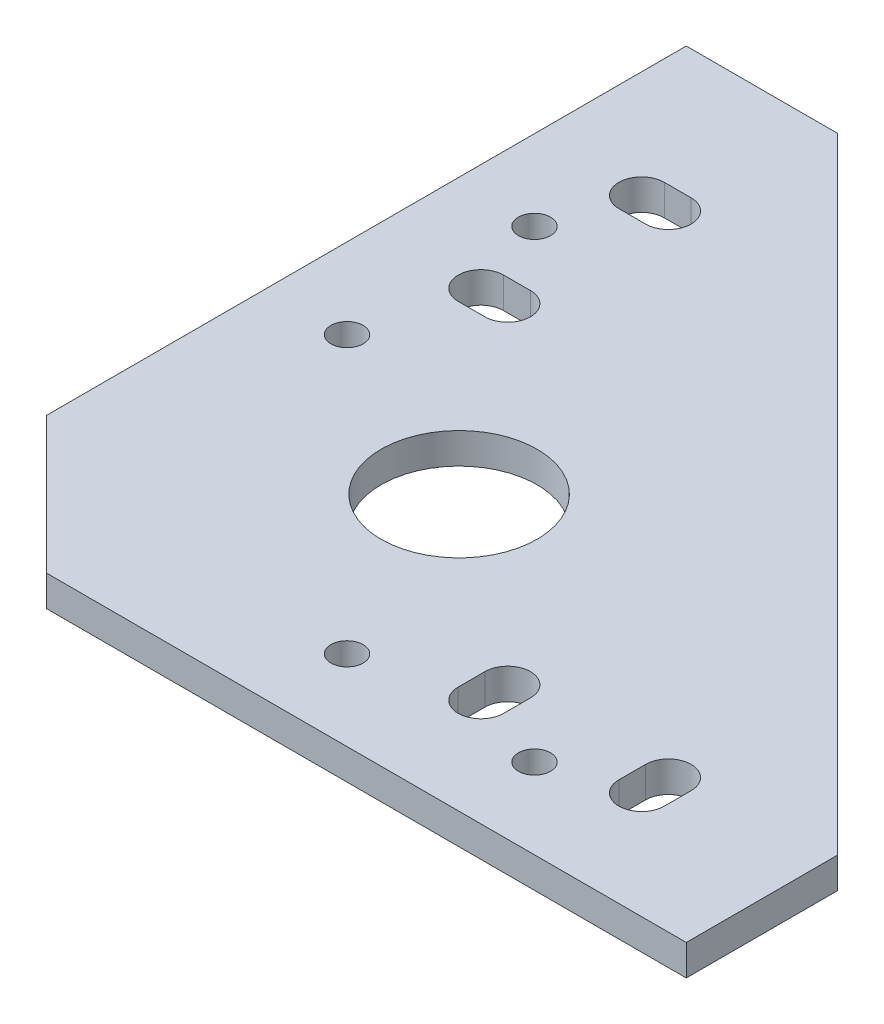
ISO-10303-21;
HEADER;
FILE_DESCRIPTION(('STEP AP214'),'2;1');
FILE_NAME('part.step','',(''),(''),'','','');
FILE_SCHEMA(('AUTOMOTIVE_DESIGN { 1 0 10303 214 1 1 1 1 }'));
ENDSEC;
DATA;
#1=APPLICATION_CONTEXT('core data for automotive mechanical design processes');
#2=APPLICATION_PROTOCOL_DEFINITION('international standard','automotive_design',2000,#1);
#3=PRODUCT_CONTEXT('',#1,'mechanical');
#4=PRODUCT('Part','Part','',(#3));
#5=PRODUCT_RELATED_PRODUCT_CATEGORY('part','',(#4));
#6=PRODUCT_DEFINITION_FORMATION('','',#4);
#7=PRODUCT_DEFINITION_CONTEXT('part definition',#1,'design');
#8=PRODUCT_DEFINITION('design','',#6,#7);
#9=PRODUCT_DEFINITION_SHAPE('','',#8);
#10=(LENGTH_UNIT() NAMED_UNIT(*) SI_UNIT(.MILLI.,.METRE.));
#11=(NAMED_UNIT(*) PLANE_ANGLE_UNIT() SI_UNIT($,.RADIAN.));
#12=(NAMED_UNIT(*) SI_UNIT($,.STERADIAN.) SOLID_ANGLE_UNIT());
#13=UNCERTAINTY_MEASURE_WITH_UNIT(LENGTH_MEASURE(1.E-05),#10,'distance_accuracy_value','');
#14=(GEOMETRIC_REPRESENTATION_CONTEXT(3) GLOBAL_UNCERTAINTY_ASSIGNED_CONTEXT((#13)) GLOBAL_UNIT_ASSIGNED_CONTEXT((#10,
#11,#12)) REPRESENTATION_CONTEXT('',''));
#15=CARTESIAN_POINT('',(0.,0.,0.));
#16=DIRECTION('',(0.,0.,1.));
#17=DIRECTION('',(1.,0.,0.));
#18=AXIS2_PLACEMENT_3D('',#15,#16,#17);
#19=CARTESIAN_POINT('',(2.3483480859519E-12,5.75,-120.868795026619));
#20=DIRECTION('',(0.,0.,-1.));
#21=DIRECTION('',(-1.,0.,0.));
#22=AXIS2_PLACEMENT_3D('',#19,#20,#21);
#23=PLANE('',#22);
#24=DIRECTION('',(1.,0.,0.));
#25=VECTOR('',#24,1.);
#26=CARTESIAN_POINT('',(2.3483480859519E-12,0.,-120.868795026619));
#27=LINE('',#26,#25);
#28=CARTESIAN_POINT('',(20.0000000000018,0.,-120.868795026618));
#29=VERTEX_POINT('',#28);
#30=CARTESIAN_POINT('',(25.0000000000018,0.,-120.868795026618));
#31=VERTEX_POINT('',#30);
#32=EDGE_CURVE('E291',#29,#31,#27,.T.);
#33=ORIENTED_EDGE('',*,*,#32,.T.);
#34=DIRECTION('',(0.,-1.,0.));
#35=VECTOR('',#34,1.);
#36=CARTESIAN_POINT('',(25.0000000000018,5.75,-120.868795026618));
#37=LINE('',#36,#35);
#38=CARTESIAN_POINT('',(25.0000000000018,5.75,-120.868795026618));
#39=VERTEX_POINT('',#38);
#40=EDGE_CURVE('E11',#39,#31,#37,.T.);
#41=ORIENTED_EDGE('',*,*,#40,.F.);
#42=DIRECTION('',(1.,0.,0.));
#43=VECTOR('',#42,1.);
#44=CARTESIAN_POINT('',(2.3483480859519E-12,5.75,-120.868795026619));
#45=LINE('',#44,#43);
#46=CARTESIAN_POINT('',(20.0000000000018,5.75,-120.868795026618));
#47=VERTEX_POINT('',#46);
#48=EDGE_CURVE('E206',#47,#39,#45,.T.);
#49=ORIENTED_EDGE('',*,*,#48,.F.);
#50=DIRECTION('',(0.,-1.,0.));
#51=VECTOR('',#50,1.);
#52=CARTESIAN_POINT('',(20.0000000000018,5.75,-120.868795026618));
#53=LINE('',#52,#51);
#54=EDGE_CURVE('E302',#47,#29,#53,.T.);
#55=ORIENTED_EDGE('',*,*,#54,.T.);
#56=EDGE_LOOP('',(#33,#41,#49,#55));
#57=FACE_BOUND('',#56,.T.);
#58=ADVANCED_FACE('F43',(#57),#23,.F.);
#59=CARTESIAN_POINT('',(25.0000000000017,5.75,-116.618795026618));
#60=DIRECTION('',(0.,-1.,0.));
#61=DIRECTION('',(0.,0.,-1.));
#62=AXIS2_PLACEMENT_3D('',#59,#60,#61);
#63=CYLINDRICAL_SURFACE('',#62,4.24999999999996);
#64=CARTESIAN_POINT('',(25.0000000000017,0.,-116.618795026618));
#65=DIRECTION('',(0.,1.,0.));
#66=DIRECTION('',(0.,0.,1.));
#67=AXIS2_PLACEMENT_3D('',#64,#65,#66);
#68=CIRCLE('',#67,4.24999999999996);
#69=CARTESIAN_POINT('',(25.0000000000017,0.,-112.368795026618));
#70=VERTEX_POINT('',#69);
#71=EDGE_CURVE('E212',#31,#70,#68,.F.);
#72=ORIENTED_EDGE('',*,*,#71,.T.);
#73=DIRECTION('',(0.,-1.,0.));
#74=VECTOR('',#73,1.);
#75=CARTESIAN_POINT('',(25.0000000000017,5.75,-112.368795026618));
#76=LINE('',#75,#74);
#77=CARTESIAN_POINT('',(25.0000000000017,5.75,-112.368795026618));
#78=VERTEX_POINT('',#77);
#79=EDGE_CURVE('E53',#78,#70,#76,.T.);
#80=ORIENTED_EDGE('',*,*,#79,.F.);
#81=CARTESIAN_POINT('',(25.0000000000017,5.75,-116.618795026618));
#82=DIRECTION('',(0.,1.,0.));
#83=DIRECTION('',(0.,0.,1.));
#84=AXIS2_PLACEMENT_3D('',#81,#82,#83);
#85=CIRCLE('',#84,4.24999999999996);
#86=EDGE_CURVE('E199',#39,#78,#85,.F.);
#87=ORIENTED_EDGE('',*,*,#86,.F.);
#88=ORIENTED_EDGE('',*,*,#40,.T.);
#89=EDGE_LOOP('',(#72,#80,#87,#88));
#90=FACE_BOUND('',#89,.T.);
#91=ADVANCED_FACE('F211',(#90),#63,.F.);
#92=CARTESIAN_POINT('',(1.87131635231905E-12,5.75,-112.368795026619));
#93=DIRECTION('',(0.,0.,-1.));
#94=DIRECTION('',(-1.,0.,0.));
#95=AXIS2_PLACEMENT_3D('',#92,#93,#94);
#96=PLANE('',#95);
#97=DIRECTION('',(1.,0.,0.));
#98=VECTOR('',#97,1.);
#99=CARTESIAN_POINT('',(1.87131635231905E-12,0.,-112.368795026619));
#100=LINE('',#99,#98);
#101=CARTESIAN_POINT('',(20.0000000000017,0.,-112.368795026618));
#102=VERTEX_POINT('',#101);
#103=EDGE_CURVE('E295',#102,#70,#100,.T.);
#104=ORIENTED_EDGE('',*,*,#103,.F.);
#105=DIRECTION('',(0.,-1.,0.));
#106=VECTOR('',#105,1.);
#107=CARTESIAN_POINT('',(20.0000000000017,5.75,-112.368795026618));
#108=LINE('',#107,#106);
#109=CARTESIAN_POINT('',(20.0000000000017,5.75,-112.368795026618));
#110=VERTEX_POINT('',#109);
#111=EDGE_CURVE('E132',#110,#102,#108,.T.);
#112=ORIENTED_EDGE('',*,*,#111,.F.);
#113=DIRECTION('',(1.,0.,0.));
#114=VECTOR('',#113,1.);
#115=CARTESIAN_POINT('',(1.87131635231905E-12,5.75,-112.368795026619));
#116=LINE('',#115,#114);
#117=EDGE_CURVE('E204',#110,#78,#116,.T.);
#118=ORIENTED_EDGE('',*,*,#117,.T.);
#119=ORIENTED_EDGE('',*,*,#79,.T.);
#120=EDGE_LOOP('',(#104,#112,#118,#119));
#121=FACE_BOUND('',#120,.T.);
#122=ADVANCED_FACE('F217',(#121),#96,.T.);
#123=CARTESIAN_POINT('',(0.,5.75,0.));
#124=DIRECTION('',(-1.,0.,0.));
#125=DIRECTION('',(0.,0.,1.));
#126=AXIS2_PLACEMENT_3D('',#123,#124,#125);
#127=PLANE('',#126);
#128=DIRECTION('',(0.,0.,-1.));
#129=VECTOR('',#128,1.);
#130=CARTESIAN_POINT('',(0.,0.,0.));
#131=LINE('',#130,#129);
#132=CARTESIAN_POINT('',(0.,0.,-25.4558441227155));
#133=VERTEX_POINT('',#132);
#134=CARTESIAN_POINT('',(0.,0.,-144.96));
#135=VERTEX_POINT('',#134);
#136=EDGE_CURVE('E273',#133,#135,#131,.T.);
#137=ORIENTED_EDGE('',*,*,#136,.F.);
#138=DIRECTION('',(0.,-1.,0.));
#139=VECTOR('',#138,1.);
#140=CARTESIAN_POINT('',(0.,5.75,-25.4558441227155));
#141=LINE('',#140,#139);
#142=CARTESIAN_POINT('',(0.,5.75,-25.4558441227155));
#143=VERTEX_POINT('',#142);
#144=EDGE_CURVE('E304',#143,#133,#141,.T.);
#145=ORIENTED_EDGE('',*,*,#144,.F.);
#146=DIRECTION('',(0.,0.,-1.));
#147=VECTOR('',#146,1.);
#148=CARTESIAN_POINT('',(0.,5.75,0.));
#149=LINE('',#148,#147);
#150=CARTESIAN_POINT('',(0.,5.75,-144.96));
#151=VERTEX_POINT('',#150);
#152=EDGE_CURVE('E398',#143,#151,#149,.T.);
#153=ORIENTED_EDGE('',*,*,#152,.T.);
#154=DIRECTION('',(0.,-1.,0.));
#155=VECTOR('',#154,1.);
#156=CARTESIAN_POINT('',(0.,5.75,-144.96));
#157=LINE('',#156,#155);
#158=EDGE_CURVE('E306',#151,#135,#157,.T.);
#159=ORIENTED_EDGE('',*,*,#158,.T.);
#160=EDGE_LOOP('',(#137,#145,#153,#159));
#161=FACE_BOUND('',#160,.T.);
#162=ADVANCED_FACE('F432',(#161),#127,.T.);
#163=CARTESIAN_POINT('',(12.7279220613578,5.75,-12.7279220613579));
#164=DIRECTION('',(0.707106781186543,0.,-0.707106781186552));
#165=DIRECTION('',(-0.707106781186552,0.,-0.707106781186543));
#166=AXIS2_PLACEMENT_3D('',#163,#164,#165);
#167=PLANE('',#166);
#168=DIRECTION('',(0.707106781186552,0.,0.707106781186543));
#169=VECTOR('',#168,1.);
#170=CARTESIAN_POINT('',(12.7279220613578,0.,-12.7279220613579));
#171=LINE('',#170,#169);
#172=CARTESIAN_POINT('',(25.4558441227158,0.,0.));
#173=VERTEX_POINT('',#172);
#174=EDGE_CURVE('E276',#133,#173,#171,.T.);
#175=ORIENTED_EDGE('',*,*,#174,.T.);
#176=DIRECTION('',(0.,-1.,0.));
#177=VECTOR('',#176,1.);
#178=CARTESIAN_POINT('',(25.4558441227158,5.75,0.));
#179=LINE('',#178,#177);
#180=CARTESIAN_POINT('',(25.4558441227158,5.75,0.));
#181=VERTEX_POINT('',#180);
#182=EDGE_CURVE('E315',#181,#173,#179,.T.);
#183=ORIENTED_EDGE('',*,*,#182,.F.);
#184=DIRECTION('',(0.707106781186552,0.,0.707106781186543));
#185=VECTOR('',#184,1.);
#186=CARTESIAN_POINT('',(12.7279220613578,5.75,-12.7279220613579));
#187=LINE('',#186,#185);
#188=EDGE_CURVE('E401',#143,#181,#187,.T.);
#189=ORIENTED_EDGE('',*,*,#188,.F.);
#190=ORIENTED_EDGE('',*,*,#144,.T.);
#191=EDGE_LOOP('',(#175,#183,#189,#190));
#192=FACE_BOUND('',#191,.T.);
#193=ADVANCED_FACE('F436',(#192),#167,.F.);
#194=CARTESIAN_POINT('',(0.,5.75,0.));
#195=DIRECTION('',(0.,0.,1.));
#196=DIRECTION('',(1.,0.,0.));
#197=AXIS2_PLACEMENT_3D('',#194,#195,#196);
#198=PLANE('',#197);
#199=DIRECTION('',(-1.,0.,0.));
#200=VECTOR('',#199,1.);
#201=CARTESIAN_POINT('',(0.,0.,0.));
#202=LINE('',#201,#200);
#203=CARTESIAN_POINT('',(144.96,0.,0.));
#204=VERTEX_POINT('',#203);
#205=EDGE_CURVE('E279',#204,#173,#202,.T.);
#206=ORIENTED_EDGE('',*,*,#205,.F.);
#207=DIRECTION('',(0.,-1.,0.));
#208=VECTOR('',#207,1.);
#209=CARTESIAN_POINT('',(144.96,5.75,0.));
#210=LINE('',#209,#208);
#211=CARTESIAN_POINT('',(144.96,5.75,0.));
#212=VERTEX_POINT('',#211);
#213=EDGE_CURVE('E313',#212,#204,#210,.T.);
#214=ORIENTED_EDGE('',*,*,#213,.F.);
#215=DIRECTION('',(-1.,0.,0.));
#216=VECTOR('',#215,1.);
#217=CARTESIAN_POINT('',(0.,5.75,0.));
#218=LINE('',#217,#216);
#219=EDGE_CURVE('E403',#212,#181,#218,.T.);
#220=ORIENTED_EDGE('',*,*,#219,.T.);
#221=ORIENTED_EDGE('',*,*,#182,.T.);
#222=EDGE_LOOP('',(#206,#214,#220,#221));
#223=FACE_BOUND('',#222,.T.);
#224=ADVANCED_FACE('F441',(#223),#198,.T.);
#225=CARTESIAN_POINT('',(144.96,5.75,0.));
#226=DIRECTION('',(1.,0.,0.));
#227=DIRECTION('',(0.,0.,-1.));
#228=AXIS2_PLACEMENT_3D('',#225,#226,#227);
#229=PLANE('',#228);
#230=DIRECTION('',(0.,0.,1.));
#231=VECTOR('',#230,1.);
#232=CARTESIAN_POINT('',(144.96,0.,0.));
#233=LINE('',#232,#231);
#234=CARTESIAN_POINT('',(144.96,0.,-28.2842712474619));
#235=VERTEX_POINT('',#234);
#236=EDGE_CURVE('E282',#235,#204,#233,.T.);
#237=ORIENTED_EDGE('',*,*,#236,.F.);
#238=DIRECTION('',(0.,-1.,0.));
#239=VECTOR('',#238,1.);
#240=CARTESIAN_POINT('',(144.96,5.75,-28.2842712474619));
#241=LINE('',#240,#239);
#242=CARTESIAN_POINT('',(144.96,5.75,-28.2842712474619));
#243=VERTEX_POINT('',#242);
#244=EDGE_CURVE('E311',#243,#235,#241,.T.);
#245=ORIENTED_EDGE('',*,*,#244,.F.);
#246=DIRECTION('',(0.,0.,1.));
#247=VECTOR('',#246,1.);
#248=CARTESIAN_POINT('',(144.96,5.75,0.));
#249=LINE('',#248,#247);
#250=EDGE_CURVE('E406',#243,#212,#249,.T.);
#251=ORIENTED_EDGE('',*,*,#250,.T.);
#252=ORIENTED_EDGE('',*,*,#213,.T.);
#253=EDGE_LOOP('',(#237,#245,#251,#252));
#254=FACE_BOUND('',#253,.T.);
#255=ADVANCED_FACE('F439',(#254),#229,.T.);
#256=CARTESIAN_POINT('',(86.6221356237309,5.75,-86.6221356237309));
#257=DIRECTION('',(0.707106781186547,0.,-0.707106781186547));
#258=DIRECTION('',(-0.707106781186548,0.,-0.707106781186548));
#259=AXIS2_PLACEMENT_3D('',#256,#257,#258);
#260=PLANE('',#259);
#261=DIRECTION('',(0.707106781186548,0.,0.707106781186548));
#262=VECTOR('',#261,1.);
#263=CARTESIAN_POINT('',(86.6221356237309,0.,-86.6221356237309));
#264=LINE('',#263,#262);
#265=CARTESIAN_POINT('',(28.2842712474619,0.,-144.96));
#266=VERTEX_POINT('',#265);
#267=EDGE_CURVE('E285',#266,#235,#264,.T.);
#268=ORIENTED_EDGE('',*,*,#267,.F.);
#269=DIRECTION('',(0.,-1.,0.));
#270=VECTOR('',#269,1.);
#271=CARTESIAN_POINT('',(28.2842712474619,5.75,-144.96));
#272=LINE('',#271,#270);
#273=CARTESIAN_POINT('',(28.2842712474619,5.75,-144.96));
#274=VERTEX_POINT('',#273);
#275=EDGE_CURVE('E308',#274,#266,#272,.T.);
#276=ORIENTED_EDGE('',*,*,#275,.F.);
#277=DIRECTION('',(0.707106781186548,0.,0.707106781186548));
#278=VECTOR('',#277,1.);
#279=CARTESIAN_POINT('',(86.6221356237309,5.75,-86.6221356237309));
#280=LINE('',#279,#278);
#281=EDGE_CURVE('E409',#274,#243,#280,.T.);
#282=ORIENTED_EDGE('',*,*,#281,.T.);
#283=ORIENTED_EDGE('',*,*,#244,.T.);
#284=EDGE_LOOP('',(#268,#276,#282,#283));
#285=FACE_BOUND('',#284,.T.);
#286=ADVANCED_FACE('F425',(#285),#260,.T.);
#287=CARTESIAN_POINT('',(86.6187950266186,5.75,-25.));
#288=DIRECTION('',(0.,-1.,0.));
#289=DIRECTION('',(0.,0.,-1.));
#290=AXIS2_PLACEMENT_3D('',#287,#288,#289);
#291=CYLINDRICAL_SURFACE('',#290,4.24999999999999);
#292=CARTESIAN_POINT('',(86.6187950266186,0.,-25.));
#293=DIRECTION('',(0.,1.,0.));
#294=DIRECTION('',(0.,0.,1.));
#295=AXIS2_PLACEMENT_3D('',#292,#293,#294);
#296=CIRCLE('',#295,4.24999999999999);
#297=CARTESIAN_POINT('',(90.8687950266185,0.,-25.));
#298=VERTEX_POINT('',#297);
#299=CARTESIAN_POINT('',(82.3687950266186,0.,-25.));
#300=VERTEX_POINT('',#299);
#301=EDGE_CURVE('E252',#298,#300,#296,.T.);
#302=ORIENTED_EDGE('',*,*,#301,.F.);
#303=DIRECTION('',(0.,-1.,0.));
#304=VECTOR('',#303,1.);
#305=CARTESIAN_POINT('',(90.8687950266185,5.75,-25.));
#306=LINE('',#305,#304);
#307=CARTESIAN_POINT('',(90.8687950266185,5.75,-25.));
#308=VERTEX_POINT('',#307);
#309=EDGE_CURVE('E309',#308,#298,#306,.T.);
#310=ORIENTED_EDGE('',*,*,#309,.F.);
#311=CARTESIAN_POINT('',(86.6187950266186,5.75,-25.));
#312=DIRECTION('',(0.,1.,0.));
#313=DIRECTION('',(0.,0.,1.));
#314=AXIS2_PLACEMENT_3D('',#311,#312,#313);
#315=CIRCLE('',#314,4.24999999999999);
#316=CARTESIAN_POINT('',(82.3687950266186,5.75,-25.));
#317=VERTEX_POINT('',#316);
#318=EDGE_CURVE('E378',#308,#317,#315,.T.);
#319=ORIENTED_EDGE('',*,*,#318,.T.);
#320=DIRECTION('',(0.,-1.,0.));
#321=VECTOR('',#320,1.);
#322=CARTESIAN_POINT('',(82.3687950266186,5.75,-25.));
#323=LINE('',#322,#321);
#324=EDGE_CURVE('E318',#317,#300,#323,.T.);
#325=ORIENTED_EDGE('',*,*,#324,.T.);
#326=EDGE_LOOP('',(#302,#310,#319,#325));
#327=FACE_BOUND('',#326,.T.);
#328=ADVANCED_FACE('F464',(#327),#291,.F.);
#329=CARTESIAN_POINT('',(90.8687950266185,5.75,0.));
#330=DIRECTION('',(-1.,0.,0.));
#331=DIRECTION('',(0.,0.,1.));
#332=AXIS2_PLACEMENT_3D('',#329,#330,#331);
#333=PLANE('',#332);
#334=DIRECTION('',(0.,0.,-1.));
#335=VECTOR('',#334,1.);
#336=CARTESIAN_POINT('',(90.8687950266185,0.,0.));
#337=LINE('',#336,#335);
#338=CARTESIAN_POINT('',(90.8687950266185,0.,-20.));
#339=VERTEX_POINT('',#338);
#340=EDGE_CURVE('E255',#339,#298,#337,.T.);
#341=ORIENTED_EDGE('',*,*,#340,.F.);
#342=DIRECTION('',(0.,-1.,0.));
#343=VECTOR('',#342,1.);
#344=CARTESIAN_POINT('',(90.8687950266185,5.75,-20.));
#345=LINE('',#344,#343);
#346=CARTESIAN_POINT('',(90.8687950266185,5.75,-20.));
#347=VERTEX_POINT('',#346);
#348=EDGE_CURVE('E323',#347,#339,#345,.T.);
#349=ORIENTED_EDGE('',*,*,#348,.F.);
#350=DIRECTION('',(0.,0.,-1.));
#351=VECTOR('',#350,1.);
#352=CARTESIAN_POINT('',(90.8687950266185,5.75,0.));
#353=LINE('',#352,#351);
#354=EDGE_CURVE('E381',#347,#308,#353,.T.);
#355=ORIENTED_EDGE('',*,*,#354,.T.);
#356=ORIENTED_EDGE('',*,*,#309,.T.);
#357=EDGE_LOOP('',(#341,#349,#355,#356));
#358=FACE_BOUND('',#357,.T.);
#359=ADVANCED_FACE('F468',(#358),#333,.T.);
#360=CARTESIAN_POINT('',(86.6187950266186,5.75,-20.));
#361=DIRECTION('',(0.,-1.,0.));
#362=DIRECTION('',(0.,0.,-1.));
#363=AXIS2_PLACEMENT_3D('',#360,#361,#362);
#364=CYLINDRICAL_SURFACE('',#363,4.24999999999999);
#365=CARTESIAN_POINT('',(86.6187950266186,0.,-20.));
#366=DIRECTION('',(0.,1.,0.));
#367=DIRECTION('',(0.,0.,1.));
#368=AXIS2_PLACEMENT_3D('',#365,#366,#367);
#369=CIRCLE('',#368,4.24999999999999);
#370=CARTESIAN_POINT('',(82.3687950266186,0.,-20.));
#371=VERTEX_POINT('',#370);
#372=EDGE_CURVE('E258',#371,#339,#369,.T.);
#373=ORIENTED_EDGE('',*,*,#372,.F.);
#374=DIRECTION('',(0.,-1.,0.));
#375=VECTOR('',#374,1.);
#376=CARTESIAN_POINT('',(82.3687950266186,5.75,-20.));
#377=LINE('',#376,#375);
#378=CARTESIAN_POINT('',(82.3687950266186,5.75,-20.));
#379=VERTEX_POINT('',#378);
#380=EDGE_CURVE('E320',#379,#371,#377,.T.);
#381=ORIENTED_EDGE('',*,*,#380,.F.);
#382=CARTESIAN_POINT('',(86.6187950266186,5.75,-20.));
#383=DIRECTION('',(0.,1.,0.));
#384=DIRECTION('',(0.,0.,1.));
#385=AXIS2_PLACEMENT_3D('',#382,#383,#384);
#386=CIRCLE('',#385,4.24999999999999);
#387=EDGE_CURVE('E384',#379,#347,#386,.T.);
#388=ORIENTED_EDGE('',*,*,#387,.T.);
#389=ORIENTED_EDGE('',*,*,#348,.T.);
#390=EDGE_LOOP('',(#373,#381,#388,#389));
#391=FACE_BOUND('',#390,.T.);
#392=ADVANCED_FACE('F474',(#391),#364,.F.);
#393=CARTESIAN_POINT('',(116.618795026619,5.75,-25.));
#394=DIRECTION('',(0.,-1.,0.));
#395=DIRECTION('',(0.,0.,-1.));
#396=AXIS2_PLACEMENT_3D('',#393,#394,#395);
#397=CYLINDRICAL_SURFACE('',#396,4.24999999999995);
#398=CARTESIAN_POINT('',(116.618795026619,0.,-25.));
#399=DIRECTION('',(0.,1.,0.));
#400=DIRECTION('',(0.,0.,1.));
#401=AXIS2_PLACEMENT_3D('',#398,#399,#400);
#402=CIRCLE('',#401,4.24999999999995);
#403=CARTESIAN_POINT('',(120.868795026618,0.,-25.));
#404=VERTEX_POINT('',#403);
#405=CARTESIAN_POINT('',(112.368795026619,0.,-25.));
#406=VERTEX_POINT('',#405);
#407=EDGE_CURVE('E240',#404,#406,#402,.T.);
#408=ORIENTED_EDGE('',*,*,#407,.F.);
#409=DIRECTION('',(0.,-1.,0.));
#410=VECTOR('',#409,1.);
#411=CARTESIAN_POINT('',(120.868795026618,5.75,-25.));
#412=LINE('',#411,#410);
#413=CARTESIAN_POINT('',(120.868795026618,5.75,-25.));
#414=VERTEX_POINT('',#413);
#415=EDGE_CURVE('E321',#414,#404,#412,.T.);
#416=ORIENTED_EDGE('',*,*,#415,.F.);
#417=CARTESIAN_POINT('',(116.618795026619,5.75,-25.));
#418=DIRECTION('',(0.,1.,0.));
#419=DIRECTION('',(0.,0.,1.));
#420=AXIS2_PLACEMENT_3D('',#417,#418,#419);
#421=CIRCLE('',#420,4.24999999999995);
#422=CARTESIAN_POINT('',(112.368795026619,5.75,-25.));
#423=VERTEX_POINT('',#422);
#424=EDGE_CURVE('E367',#414,#423,#421,.T.);
#425=ORIENTED_EDGE('',*,*,#424,.T.);
#426=DIRECTION('',(0.,-1.,0.));
#427=VECTOR('',#426,1.);
#428=CARTESIAN_POINT('',(112.368795026619,5.75,-25.));
#429=LINE('',#428,#427);
#430=EDGE_CURVE('E326',#423,#406,#429,.T.);
#431=ORIENTED_EDGE('',*,*,#430,.T.);
#432=EDGE_LOOP('',(#408,#416,#425,#431));
#433=FACE_BOUND('',#432,.T.);
#434=ADVANCED_FACE('F493',(#433),#397,.F.);
#435=CARTESIAN_POINT('',(120.868795026618,5.75,0.));
#436=DIRECTION('',(-1.,0.,0.));
#437=DIRECTION('',(0.,0.,1.));
#438=AXIS2_PLACEMENT_3D('',#435,#436,#437);
#439=PLANE('',#438);
#440=DIRECTION('',(0.,0.,-1.));
#441=VECTOR('',#440,1.);
#442=CARTESIAN_POINT('',(120.868795026618,0.,0.));
#443=LINE('',#442,#441);
#444=CARTESIAN_POINT('',(120.868795026618,0.,-20.));
#445=VERTEX_POINT('',#444);
#446=EDGE_CURVE('E243',#445,#404,#443,.T.);
#447=ORIENTED_EDGE('',*,*,#446,.F.);
#448=DIRECTION('',(0.,-1.,0.));
#449=VECTOR('',#448,1.);
#450=CARTESIAN_POINT('',(120.868795026618,5.75,-20.));
#451=LINE('',#450,#449);
#452=CARTESIAN_POINT('',(120.868795026618,5.75,-20.));
#453=VERTEX_POINT('',#452);
#454=EDGE_CURVE('E330',#453,#445,#451,.T.);
#455=ORIENTED_EDGE('',*,*,#454,.F.);
#456=DIRECTION('',(0.,0.,-1.));
#457=VECTOR('',#456,1.);
#458=CARTESIAN_POINT('',(120.868795026618,5.75,0.));
#459=LINE('',#458,#457);
#460=EDGE_CURVE('E370',#453,#414,#459,.T.);
#461=ORIENTED_EDGE('',*,*,#460,.T.);
#462=ORIENTED_EDGE('',*,*,#415,.T.);
#463=EDGE_LOOP('',(#447,#455,#461,#462));
#464=FACE_BOUND('',#463,.T.);
#465=ADVANCED_FACE('F489',(#464),#439,.T.);
#466=CARTESIAN_POINT('',(116.618795026619,5.75,-20.));
#467=DIRECTION('',(0.,-1.,0.));
#468=DIRECTION('',(0.,0.,-1.));
#469=AXIS2_PLACEMENT_3D('',#466,#467,#468);
#470=CYLINDRICAL_SURFACE('',#469,4.24999999999995);
#471=CARTESIAN_POINT('',(116.618795026619,0.,-20.));
#472=DIRECTION('',(0.,1.,0.));
#473=DIRECTION('',(0.,0.,1.));
#474=AXIS2_PLACEMENT_3D('',#471,#472,#473);
#475=CIRCLE('',#474,4.24999999999995);
#476=CARTESIAN_POINT('',(112.368795026619,0.,-20.));
#477=VERTEX_POINT('',#476);
#478=EDGE_CURVE('E246',#477,#445,#475,.T.);
#479=ORIENTED_EDGE('',*,*,#478,.F.);
#480=DIRECTION('',(0.,-1.,0.));
#481=VECTOR('',#480,1.);
#482=CARTESIAN_POINT('',(112.368795026619,5.75,-20.));
#483=LINE('',#482,#481);
#484=CARTESIAN_POINT('',(112.368795026619,5.75,-20.));
#485=VERTEX_POINT('',#484);
#486=EDGE_CURVE('E328',#485,#477,#483,.T.);
#487=ORIENTED_EDGE('',*,*,#486,.F.);
#488=CARTESIAN_POINT('',(116.618795026619,5.75,-20.));
#489=DIRECTION('',(0.,1.,0.));
#490=DIRECTION('',(0.,0.,1.));
#491=AXIS2_PLACEMENT_3D('',#488,#489,#490);
#492=CIRCLE('',#491,4.24999999999995);
#493=EDGE_CURVE('E373',#485,#453,#492,.T.);
#494=ORIENTED_EDGE('',*,*,#493,.T.);
#495=ORIENTED_EDGE('',*,*,#454,.T.);
#496=EDGE_LOOP('',(#479,#487,#494,#495));
#497=FACE_BOUND('',#496,.T.);
#498=ADVANCED_FACE('F486',(#497),#470,.F.);
#499=CARTESIAN_POINT('',(1.76548099802369E-12,5.75,-90.8687950266187));
#500=DIRECTION('',(0.,0.,-1.));
#501=DIRECTION('',(-1.,0.,0.));
#502=AXIS2_PLACEMENT_3D('',#499,#500,#501);
#503=PLANE('',#502);
#504=DIRECTION('',(1.,0.,0.));
#505=VECTOR('',#504,1.);
#506=CARTESIAN_POINT('',(1.76548099802369E-12,0.,-90.8687950266187));
#507=LINE('',#506,#505);
#508=CARTESIAN_POINT('',(20.0000000000014,0.,-90.8687950266183));
#509=VERTEX_POINT('',#508);
#510=CARTESIAN_POINT('',(25.0000000000013,0.,-90.8687950266182));
#511=VERTEX_POINT('',#510);
#512=EDGE_CURVE('E226',#509,#511,#507,.T.);
#513=ORIENTED_EDGE('',*,*,#512,.T.);
#514=DIRECTION('',(0.,-1.,0.));
#515=VECTOR('',#514,1.);
#516=CARTESIAN_POINT('',(25.0000000000013,5.75,-90.8687950266182));
#517=LINE('',#516,#515);
#518=CARTESIAN_POINT('',(25.0000000000013,5.75,-90.8687950266182));
#519=VERTEX_POINT('',#518);
#520=EDGE_CURVE('E47',#519,#511,#517,.T.);
#521=ORIENTED_EDGE('',*,*,#520,.F.);
#522=DIRECTION('',(1.,0.,0.));
#523=VECTOR('',#522,1.);
#524=CARTESIAN_POINT('',(1.76548099802369E-12,5.75,-90.8687950266187));
#525=LINE('',#524,#523);
#526=CARTESIAN_POINT('',(20.0000000000014,5.75,-90.8687950266183));
#527=VERTEX_POINT('',#526);
#528=EDGE_CURVE('E301',#527,#519,#525,.T.);
#529=ORIENTED_EDGE('',*,*,#528,.F.);
#530=DIRECTION('',(0.,-1.,0.));
#531=VECTOR('',#530,1.);
#532=CARTESIAN_POINT('',(20.0000000000014,5.75,-90.8687950266183));
#533=LINE('',#532,#531);
#534=EDGE_CURVE('E225',#527,#509,#533,.T.);
#535=ORIENTED_EDGE('',*,*,#534,.T.);
#536=EDGE_LOOP('',(#513,#521,#529,#535));
#537=FACE_BOUND('',#536,.T.);
#538=ADVANCED_FACE('F45',(#537),#503,.F.);
#539=CARTESIAN_POINT('',(25.0000000000013,5.75,-86.6187950266182));
#540=DIRECTION('',(0.,-1.,0.));
#541=DIRECTION('',(0.,0.,-1.));
#542=AXIS2_PLACEMENT_3D('',#539,#540,#541);
#543=CYLINDRICAL_SURFACE('',#542,4.24999999999999);
#544=CARTESIAN_POINT('',(25.0000000000013,0.,-86.6187950266182));
#545=DIRECTION('',(0.,1.,0.));
#546=DIRECTION('',(0.,0.,1.));
#547=AXIS2_PLACEMENT_3D('',#544,#545,#546);
#548=CIRCLE('',#547,4.24999999999999);
#549=CARTESIAN_POINT('',(25.0000000000012,0.,-82.3687950266182));
#550=VERTEX_POINT('',#549);
#551=EDGE_CURVE('E229',#511,#550,#548,.F.);
#552=ORIENTED_EDGE('',*,*,#551,.T.);
#553=DIRECTION('',(0.,-1.,0.));
#554=VECTOR('',#553,1.);
#555=CARTESIAN_POINT('',(25.0000000000012,5.75,-82.3687950266182));
#556=LINE('',#555,#554);
#557=CARTESIAN_POINT('',(25.0000000000012,5.75,-82.3687950266182));
#558=VERTEX_POINT('',#557);
#559=EDGE_CURVE('E336',#558,#550,#556,.T.);
#560=ORIENTED_EDGE('',*,*,#559,.F.);
#561=CARTESIAN_POINT('',(25.0000000000013,5.75,-86.6187950266182));
#562=DIRECTION('',(0.,1.,0.));
#563=DIRECTION('',(0.,0.,1.));
#564=AXIS2_PLACEMENT_3D('',#561,#562,#563);
#565=CIRCLE('',#564,4.24999999999999);
#566=EDGE_CURVE('E144',#519,#558,#565,.F.);
#567=ORIENTED_EDGE('',*,*,#566,.F.);
#568=ORIENTED_EDGE('',*,*,#520,.T.);
#569=EDGE_LOOP('',(#552,#560,#567,#568));
#570=FACE_BOUND('',#569,.T.);
#571=ADVANCED_FACE('F341',(#570),#543,.F.);
#572=CARTESIAN_POINT('',(1.14309665936478E-12,5.75,-82.3687950266185));
#573=DIRECTION('',(0.,0.,-1.));
#574=DIRECTION('',(-1.,0.,0.));
#575=AXIS2_PLACEMENT_3D('',#572,#573,#574);
#576=PLANE('',#575);
#577=DIRECTION('',(1.,0.,0.));
#578=VECTOR('',#577,1.);
#579=CARTESIAN_POINT('',(1.14309665936478E-12,0.,-82.3687950266185));
#580=LINE('',#579,#578);
#581=CARTESIAN_POINT('',(20.0000000000012,0.,-82.3687950266183));
#582=VERTEX_POINT('',#581);
#583=EDGE_CURVE('E232',#582,#550,#580,.T.);
#584=ORIENTED_EDGE('',*,*,#583,.F.);
#585=DIRECTION('',(0.,-1.,0.));
#586=VECTOR('',#585,1.);
#587=CARTESIAN_POINT('',(20.0000000000012,5.75,-82.3687950266183));
#588=LINE('',#587,#586);
#589=CARTESIAN_POINT('',(20.0000000000012,5.75,-82.3687950266183));
#590=VERTEX_POINT('',#589);
#591=EDGE_CURVE('E335',#590,#582,#588,.T.);
#592=ORIENTED_EDGE('',*,*,#591,.F.);
#593=DIRECTION('',(1.,0.,0.));
#594=VECTOR('',#593,1.);
#595=CARTESIAN_POINT('',(1.14309665936478E-12,5.75,-82.3687950266185));
#596=LINE('',#595,#594);
#597=EDGE_CURVE('E353',#590,#558,#596,.T.);
#598=ORIENTED_EDGE('',*,*,#597,.T.);
#599=ORIENTED_EDGE('',*,*,#559,.T.);
#600=EDGE_LOOP('',(#584,#592,#598,#599));
#601=FACE_BOUND('',#600,.T.);
#602=ADVANCED_FACE('F350',(#601),#576,.T.);
#603=CARTESIAN_POINT('',(20.0000000000018,5.75,-116.618795026618));
#604=DIRECTION('',(0.,-1.,0.));
#605=DIRECTION('',(0.,0.,-1.));
#606=AXIS2_PLACEMENT_3D('',#603,#604,#605);
#607=CYLINDRICAL_SURFACE('',#606,4.24999999999996);
#608=CARTESIAN_POINT('',(20.0000000000018,0.,-116.618795026618));
#609=DIRECTION('',(0.,1.,0.));
#610=DIRECTION('',(0.,0.,1.));
#611=AXIS2_PLACEMENT_3D('',#608,#609,#610);
#612=CIRCLE('',#611,4.24999999999996);
#613=EDGE_CURVE('E135',#102,#29,#612,.F.);
#614=ORIENTED_EDGE('',*,*,#613,.T.);
#615=ORIENTED_EDGE('',*,*,#54,.F.);
#616=CARTESIAN_POINT('',(20.0000000000018,5.75,-116.618795026618));
#617=DIRECTION('',(0.,1.,0.));
#618=DIRECTION('',(0.,0.,1.));
#619=AXIS2_PLACEMENT_3D('',#616,#617,#618);
#620=CIRCLE('',#619,4.24999999999996);
#621=EDGE_CURVE('E62',#110,#47,#620,.F.);
#622=ORIENTED_EDGE('',*,*,#621,.F.);
#623=ORIENTED_EDGE('',*,*,#111,.T.);
#624=EDGE_LOOP('',(#614,#615,#622,#623));
#625=FACE_BOUND('',#624,.T.);
#626=ADVANCED_FACE('F462',(#625),#607,.F.);
#627=CARTESIAN_POINT('',(0.,5.75,-144.96));
#628=DIRECTION('',(0.,0.,-1.));
#629=DIRECTION('',(-1.,0.,0.));
#630=AXIS2_PLACEMENT_3D('',#627,#628,#629);
#631=PLANE('',#630);
#632=DIRECTION('',(1.,0.,0.));
#633=VECTOR('',#632,1.);
#634=CARTESIAN_POINT('',(0.,0.,-144.96));
#635=LINE('',#634,#633);
#636=EDGE_CURVE('E288',#135,#266,#635,.T.);
#637=ORIENTED_EDGE('',*,*,#636,.F.);
#638=ORIENTED_EDGE('',*,*,#158,.F.);
#639=DIRECTION('',(1.,0.,0.));
#640=VECTOR('',#639,1.);
#641=CARTESIAN_POINT('',(0.,5.75,-144.96));
#642=LINE('',#641,#640);
#643=EDGE_CURVE('E412',#151,#274,#642,.T.);
#644=ORIENTED_EDGE('',*,*,#643,.T.);
#645=ORIENTED_EDGE('',*,*,#275,.T.);
#646=EDGE_LOOP('',(#637,#638,#644,#645));
#647=FACE_BOUND('',#646,.T.);
#648=ADVANCED_FACE('F417',(#647),#631,.T.);
#649=CARTESIAN_POINT('',(51.27,5.75,-51.27));
#650=DIRECTION('',(0.,-1.,0.));
#651=DIRECTION('',(0.,0.,-1.));
#652=AXIS2_PLACEMENT_3D('',#649,#650,#651);
#653=CYLINDRICAL_SURFACE('',#652,14.5684677026134);
#654=CARTESIAN_POINT('',(51.27,5.75,-51.27));
#655=DIRECTION('',(0.,1.,0.));
#656=DIRECTION('',(0.,0.,1.));
#657=AXIS2_PLACEMENT_3D('',#654,#655,#656);
#658=CIRCLE('',#657,14.5684677026134);
#659=CARTESIAN_POINT('',(51.27,5.75,-36.7015322973866));
#660=VERTEX_POINT('',#659);
#661=EDGE_CURVE('E395',#660,#660,#658,.T.);
#662=ORIENTED_EDGE('',*,*,#661,.T.);
#663=EDGE_LOOP('',(#662));
#664=FACE_BOUND('',#663,.T.);
#665=CARTESIAN_POINT('',(51.27,0.,-51.27));
#666=DIRECTION('',(0.,1.,0.));
#667=DIRECTION('',(0.,0.,1.));
#668=AXIS2_PLACEMENT_3D('',#665,#666,#667);
#669=CIRCLE('',#668,14.5684677026134);
#670=CARTESIAN_POINT('',(51.27,0.,-36.7015322973866));
#671=VERTEX_POINT('',#670);
#672=EDGE_CURVE('E270',#671,#671,#669,.T.);
#673=ORIENTED_EDGE('',*,*,#672,.F.);
#674=EDGE_LOOP('',(#673));
#675=FACE_BOUND('',#674,.T.);
#676=ADVANCED_FACE('F461',(#664,#675),#653,.F.);
#677=CARTESIAN_POINT('',(66.6187950266186,5.75,-15.));
#678=DIRECTION('',(0.,-1.,0.));
#679=DIRECTION('',(0.,0.,-1.));
#680=AXIS2_PLACEMENT_3D('',#677,#678,#679);
#681=CYLINDRICAL_SURFACE('',#680,3.00000000000001);
#682=CARTESIAN_POINT('',(66.6187950266186,5.75,-15.));
#683=DIRECTION('',(0.,1.,0.));
#684=DIRECTION('',(0.,0.,1.));
#685=AXIS2_PLACEMENT_3D('',#682,#683,#684);
#686=CIRCLE('',#685,3.00000000000001);
#687=CARTESIAN_POINT('',(66.6187950266186,5.75,-12.));
#688=VERTEX_POINT('',#687);
#689=EDGE_CURVE('E392',#688,#688,#686,.T.);
#690=ORIENTED_EDGE('',*,*,#689,.T.);
#691=EDGE_LOOP('',(#690));
#692=FACE_BOUND('',#691,.T.);
#693=CARTESIAN_POINT('',(66.6187950266186,0.,-15.));
#694=DIRECTION('',(0.,1.,0.));
#695=DIRECTION('',(0.,0.,1.));
#696=AXIS2_PLACEMENT_3D('',#693,#694,#695);
#697=CIRCLE('',#696,3.00000000000001);
#698=CARTESIAN_POINT('',(66.6187950266186,0.,-12.));
#699=VERTEX_POINT('',#698);
#700=EDGE_CURVE('E267',#699,#699,#697,.T.);
#701=ORIENTED_EDGE('',*,*,#700,.F.);
#702=EDGE_LOOP('',(#701));
#703=FACE_BOUND('',#702,.T.);
#704=ADVANCED_FACE('F647',(#692,#703),#681,.F.);
#705=CARTESIAN_POINT('',(101.618795026619,5.75,-15.));
#706=DIRECTION('',(0.,-1.,0.));
#707=DIRECTION('',(0.,0.,-1.));
#708=AXIS2_PLACEMENT_3D('',#705,#706,#707);
#709=CYLINDRICAL_SURFACE('',#708,3.00000000000001);
#710=CARTESIAN_POINT('',(101.618795026619,5.75,-15.));
#711=DIRECTION('',(0.,1.,0.));
#712=DIRECTION('',(0.,0.,1.));
#713=AXIS2_PLACEMENT_3D('',#710,#711,#712);
#714=CIRCLE('',#713,3.00000000000001);
#715=CARTESIAN_POINT('',(101.618795026619,5.75,-12.));
#716=VERTEX_POINT('',#715);
#717=EDGE_CURVE('E389',#716,#716,#714,.T.);
#718=ORIENTED_EDGE('',*,*,#717,.T.);
#719=EDGE_LOOP('',(#718));
#720=FACE_BOUND('',#719,.T.);
#721=CARTESIAN_POINT('',(101.618795026619,0.,-15.));
#722=DIRECTION('',(0.,1.,0.));
#723=DIRECTION('',(0.,0.,1.));
#724=AXIS2_PLACEMENT_3D('',#721,#722,#723);
#725=CIRCLE('',#724,3.00000000000001);
#726=CARTESIAN_POINT('',(101.618795026619,0.,-12.));
#727=VERTEX_POINT('',#726);
#728=EDGE_CURVE('E264',#727,#727,#725,.T.);
#729=ORIENTED_EDGE('',*,*,#728,.F.);
#730=EDGE_LOOP('',(#729));
#731=FACE_BOUND('',#730,.T.);
#732=ADVANCED_FACE('F638',(#720,#731),#709,.F.);
#733=CARTESIAN_POINT('',(82.3687950266186,5.75,0.));
#734=DIRECTION('',(-1.,0.,0.));
#735=DIRECTION('',(0.,0.,1.));
#736=AXIS2_PLACEMENT_3D('',#733,#734,#735);
#737=PLANE('',#736);
#738=DIRECTION('',(0.,0.,-1.));
#739=VECTOR('',#738,1.);
#740=CARTESIAN_POINT('',(82.3687950266186,0.,0.));
#741=LINE('',#740,#739);
#742=EDGE_CURVE('E261',#371,#300,#741,.T.);
#743=ORIENTED_EDGE('',*,*,#742,.T.);
#744=ORIENTED_EDGE('',*,*,#324,.F.);
#745=DIRECTION('',(0.,0.,-1.));
#746=VECTOR('',#745,1.);
#747=CARTESIAN_POINT('',(82.3687950266186,5.75,0.));
#748=LINE('',#747,#746);
#749=EDGE_CURVE('E387',#379,#317,#748,.T.);
#750=ORIENTED_EDGE('',*,*,#749,.F.);
#751=ORIENTED_EDGE('',*,*,#380,.T.);
#752=EDGE_LOOP('',(#743,#744,#750,#751));
#753=FACE_BOUND('',#752,.T.);
#754=ADVANCED_FACE('F484',(#753),#737,.F.);
#755=CARTESIAN_POINT('',(112.368795026619,5.75,0.));
#756=DIRECTION('',(-1.,0.,0.));
#757=DIRECTION('',(0.,0.,1.));
#758=AXIS2_PLACEMENT_3D('',#755,#756,#757);
#759=PLANE('',#758);
#760=DIRECTION('',(0.,0.,-1.));
#761=VECTOR('',#760,1.);
#762=CARTESIAN_POINT('',(112.368795026619,0.,0.));
#763=LINE('',#762,#761);
#764=EDGE_CURVE('E249',#477,#406,#763,.T.);
#765=ORIENTED_EDGE('',*,*,#764,.T.);
#766=ORIENTED_EDGE('',*,*,#430,.F.);
#767=DIRECTION('',(0.,0.,-1.));
#768=VECTOR('',#767,1.);
#769=CARTESIAN_POINT('',(112.368795026619,5.75,0.));
#770=LINE('',#769,#768);
#771=EDGE_CURVE('E376',#485,#423,#770,.T.);
#772=ORIENTED_EDGE('',*,*,#771,.F.);
#773=ORIENTED_EDGE('',*,*,#486,.T.);
#774=EDGE_LOOP('',(#765,#766,#772,#773));
#775=FACE_BOUND('',#774,.T.);
#776=ADVANCED_FACE('F480',(#775),#759,.F.);
#777=CARTESIAN_POINT('',(15.0000000000015,5.75,-101.618795026618));
#778=DIRECTION('',(0.,-1.,0.));
#779=DIRECTION('',(0.,0.,-1.));
#780=AXIS2_PLACEMENT_3D('',#777,#778,#779);
#781=CYLINDRICAL_SURFACE('',#780,3.);
#782=CARTESIAN_POINT('',(15.0000000000015,5.75,-101.618795026618));
#783=DIRECTION('',(0.,1.,0.));
#784=DIRECTION('',(0.,0.,1.));
#785=AXIS2_PLACEMENT_3D('',#782,#783,#784);
#786=CIRCLE('',#785,3.);
#787=CARTESIAN_POINT('',(15.0000000000015,5.75,-98.6187950266183));
#788=VERTEX_POINT('',#787);
#789=EDGE_CURVE('E358',#788,#788,#786,.F.);
#790=ORIENTED_EDGE('',*,*,#789,.F.);
#791=EDGE_LOOP('',(#790));
#792=FACE_BOUND('',#791,.T.);
#793=CARTESIAN_POINT('',(15.0000000000015,0.,-101.618795026618));
#794=DIRECTION('',(0.,1.,0.));
#795=DIRECTION('',(0.,0.,1.));
#796=AXIS2_PLACEMENT_3D('',#793,#794,#795);
#797=CIRCLE('',#796,3.);
#798=CARTESIAN_POINT('',(15.0000000000015,0.,-98.6187950266183));
#799=VERTEX_POINT('',#798);
#800=EDGE_CURVE('E237',#799,#799,#797,.F.);
#801=ORIENTED_EDGE('',*,*,#800,.T.);
#802=EDGE_LOOP('',(#801));
#803=FACE_BOUND('',#802,.T.);
#804=ADVANCED_FACE('F483',(#792,#803),#781,.F.);
#805=CARTESIAN_POINT('',(20.0000000000013,5.75,-86.6187950266183));
#806=DIRECTION('',(0.,-1.,0.));
#807=DIRECTION('',(0.,0.,-1.));
#808=AXIS2_PLACEMENT_3D('',#805,#806,#807);
#809=CYLINDRICAL_SURFACE('',#808,4.25);
#810=CARTESIAN_POINT('',(20.0000000000013,0.,-86.6187950266183));
#811=DIRECTION('',(0.,1.,0.));
#812=DIRECTION('',(0.,0.,1.));
#813=AXIS2_PLACEMENT_3D('',#810,#811,#812);
#814=CIRCLE('',#813,4.25);
#815=EDGE_CURVE('E235',#582,#509,#814,.F.);
#816=ORIENTED_EDGE('',*,*,#815,.T.);
#817=ORIENTED_EDGE('',*,*,#534,.F.);
#818=CARTESIAN_POINT('',(20.0000000000013,5.75,-86.6187950266183));
#819=DIRECTION('',(0.,1.,0.));
#820=DIRECTION('',(0.,0.,1.));
#821=AXIS2_PLACEMENT_3D('',#818,#819,#820);
#822=CIRCLE('',#821,4.25);
#823=EDGE_CURVE('E355',#590,#527,#822,.F.);
#824=ORIENTED_EDGE('',*,*,#823,.F.);
#825=ORIENTED_EDGE('',*,*,#591,.T.);
#826=EDGE_LOOP('',(#816,#817,#824,#825));
#827=FACE_BOUND('',#826,.T.);
#828=ADVANCED_FACE('F356',(#827),#809,.F.);
#829=CARTESIAN_POINT('',(15.000000000001,5.75,-66.6187950266183));
#830=DIRECTION('',(0.,-1.,0.));
#831=DIRECTION('',(0.,0.,-1.));
#832=AXIS2_PLACEMENT_3D('',#829,#830,#831);
#833=CYLINDRICAL_SURFACE('',#832,3.);
#834=CARTESIAN_POINT('',(15.000000000001,5.75,-66.6187950266183));
#835=DIRECTION('',(0.,1.,0.));
#836=DIRECTION('',(0.,0.,1.));
#837=AXIS2_PLACEMENT_3D('',#834,#835,#836);
#838=CIRCLE('',#837,3.);
#839=CARTESIAN_POINT('',(15.000000000001,5.75,-63.6187950266183));
#840=VERTEX_POINT('',#839);
#841=EDGE_CURVE('E219',#840,#840,#838,.F.);
#842=ORIENTED_EDGE('',*,*,#841,.F.);
#843=EDGE_LOOP('',(#842));
#844=FACE_BOUND('',#843,.T.);
#845=CARTESIAN_POINT('',(15.000000000001,0.,-66.6187950266183));
#846=DIRECTION('',(0.,1.,0.));
#847=DIRECTION('',(0.,0.,1.));
#848=AXIS2_PLACEMENT_3D('',#845,#846,#847);
#849=CIRCLE('',#848,3.);
#850=CARTESIAN_POINT('',(15.000000000001,0.,-63.6187950266183));
#851=VERTEX_POINT('',#850);
#852=EDGE_CURVE('E298',#851,#851,#849,.F.);
#853=ORIENTED_EDGE('',*,*,#852,.T.);
#854=EDGE_LOOP('',(#853));
#855=FACE_BOUND('',#854,.T.);
#856=ADVANCED_FACE('F503',(#844,#855),#833,.F.);
#857=CARTESIAN_POINT('',(0.,5.75,0.));
#858=DIRECTION('',(0.,1.,0.));
#859=DIRECTION('',(0.,0.,1.));
#860=AXIS2_PLACEMENT_3D('',#857,#858,#859);
#861=PLANE('',#860);
#862=ORIENTED_EDGE('',*,*,#528,.T.);
#863=ORIENTED_EDGE('',*,*,#566,.T.);
#864=ORIENTED_EDGE('',*,*,#597,.F.);
#865=ORIENTED_EDGE('',*,*,#823,.T.);
#866=EDGE_LOOP('',(#862,#863,#864,#865));
#867=FACE_BOUND('',#866,.T.);
#868=ORIENTED_EDGE('',*,*,#789,.T.);
#869=EDGE_LOOP('',(#868));
#870=FACE_BOUND('',#869,.T.);
#871=ORIENTED_EDGE('',*,*,#424,.F.);
#872=ORIENTED_EDGE('',*,*,#460,.F.);
#873=ORIENTED_EDGE('',*,*,#493,.F.);
#874=ORIENTED_EDGE('',*,*,#771,.T.);
#875=EDGE_LOOP('',(#871,#872,#873,#874));
#876=FACE_BOUND('',#875,.T.);
#877=ORIENTED_EDGE('',*,*,#318,.F.);
#878=ORIENTED_EDGE('',*,*,#354,.F.);
#879=ORIENTED_EDGE('',*,*,#387,.F.);
#880=ORIENTED_EDGE('',*,*,#749,.T.);
#881=EDGE_LOOP('',(#877,#878,#879,#880));
#882=FACE_BOUND('',#881,.T.);
#883=ORIENTED_EDGE('',*,*,#717,.F.);
#884=EDGE_LOOP('',(#883));
#885=FACE_BOUND('',#884,.T.);
#886=ORIENTED_EDGE('',*,*,#689,.F.);
#887=EDGE_LOOP('',(#886));
#888=FACE_BOUND('',#887,.T.);
#889=ORIENTED_EDGE('',*,*,#661,.F.);
#890=EDGE_LOOP('',(#889));
#891=FACE_BOUND('',#890,.T.);
#892=ORIENTED_EDGE('',*,*,#152,.F.);
#893=ORIENTED_EDGE('',*,*,#188,.T.);
#894=ORIENTED_EDGE('',*,*,#219,.F.);
#895=ORIENTED_EDGE('',*,*,#250,.F.);
#896=ORIENTED_EDGE('',*,*,#281,.F.);
#897=ORIENTED_EDGE('',*,*,#643,.F.);
#898=EDGE_LOOP('',(#892,#893,#894,#895,#896,#897));
#899=FACE_BOUND('',#898,.T.);
#900=ORIENTED_EDGE('',*,*,#48,.T.);
#901=ORIENTED_EDGE('',*,*,#86,.T.);
#902=ORIENTED_EDGE('',*,*,#117,.F.);
#903=ORIENTED_EDGE('',*,*,#621,.T.);
#904=EDGE_LOOP('',(#900,#901,#902,#903));
#905=FACE_BOUND('',#904,.T.);
#906=ORIENTED_EDGE('',*,*,#841,.T.);
#907=EDGE_LOOP('',(#906));
#908=FACE_BOUND('',#907,.T.);
#909=ADVANCED_FACE('F201',(#867,#870,#876,#882,#885,#888,#891,#899,#905,#908),#861,.T.);
#910=CARTESIAN_POINT('',(0.,0.,0.));
#911=DIRECTION('',(0.,1.,0.));
#912=DIRECTION('',(0.,0.,1.));
#913=AXIS2_PLACEMENT_3D('',#910,#911,#912);
#914=PLANE('',#913);
#915=ORIENTED_EDGE('',*,*,#512,.F.);
#916=ORIENTED_EDGE('',*,*,#815,.F.);
#917=ORIENTED_EDGE('',*,*,#583,.T.);
#918=ORIENTED_EDGE('',*,*,#551,.F.);
#919=EDGE_LOOP('',(#915,#916,#917,#918));
#920=FACE_BOUND('',#919,.T.);
#921=ORIENTED_EDGE('',*,*,#800,.F.);
#922=EDGE_LOOP('',(#921));
#923=FACE_BOUND('',#922,.T.);
#924=ORIENTED_EDGE('',*,*,#407,.T.);
#925=ORIENTED_EDGE('',*,*,#764,.F.);
#926=ORIENTED_EDGE('',*,*,#478,.T.);
#927=ORIENTED_EDGE('',*,*,#446,.T.);
#928=EDGE_LOOP('',(#924,#925,#926,#927));
#929=FACE_BOUND('',#928,.T.);
#930=ORIENTED_EDGE('',*,*,#301,.T.);
#931=ORIENTED_EDGE('',*,*,#742,.F.);
#932=ORIENTED_EDGE('',*,*,#372,.T.);
#933=ORIENTED_EDGE('',*,*,#340,.T.);
#934=EDGE_LOOP('',(#930,#931,#932,#933));
#935=FACE_BOUND('',#934,.T.);
#936=ORIENTED_EDGE('',*,*,#728,.T.);
#937=EDGE_LOOP('',(#936));
#938=FACE_BOUND('',#937,.T.);
#939=ORIENTED_EDGE('',*,*,#700,.T.);
#940=EDGE_LOOP('',(#939));
#941=FACE_BOUND('',#940,.T.);
#942=ORIENTED_EDGE('',*,*,#672,.T.);
#943=EDGE_LOOP('',(#942));
#944=FACE_BOUND('',#943,.T.);
#945=ORIENTED_EDGE('',*,*,#136,.T.);
#946=ORIENTED_EDGE('',*,*,#636,.T.);
#947=ORIENTED_EDGE('',*,*,#267,.T.);
#948=ORIENTED_EDGE('',*,*,#236,.T.);
#949=ORIENTED_EDGE('',*,*,#205,.T.);
#950=ORIENTED_EDGE('',*,*,#174,.F.);
#951=EDGE_LOOP('',(#945,#946,#947,#948,#949,#950));
#952=FACE_BOUND('',#951,.T.);
#953=ORIENTED_EDGE('',*,*,#32,.F.);
#954=ORIENTED_EDGE('',*,*,#613,.F.);
#955=ORIENTED_EDGE('',*,*,#103,.T.);
#956=ORIENTED_EDGE('',*,*,#71,.F.);
#957=EDGE_LOOP('',(#953,#954,#955,#956));
#958=FACE_BOUND('',#957,.T.);
#959=ORIENTED_EDGE('',*,*,#852,.F.);
#960=EDGE_LOOP('',(#959));
#961=FACE_BOUND('',#960,.T.);
#962=ADVANCED_FACE('F348',(#920,#923,#929,#935,#938,#941,#944,#952,#958,#961),#914,.F.);
#963=CLOSED_SHELL('',(#58,#91,#122,#162,#193,#224,#255,#286,#328,#359,#392,#434,#465,#498,#538,
#571,#602,#626,#648,#676,#704,#732,#754,#776,#804,#828,#856,#909,#962));
#964=MANIFOLD_SOLID_BREP('B2',#963);
#965=ADVANCED_BREP_SHAPE_REPRESENTATION('',(#18,#964),#14);
#966=SHAPE_DEFINITION_REPRESENTATION(#9,#965);
ENDSEC;
END-ISO-10303-21;
